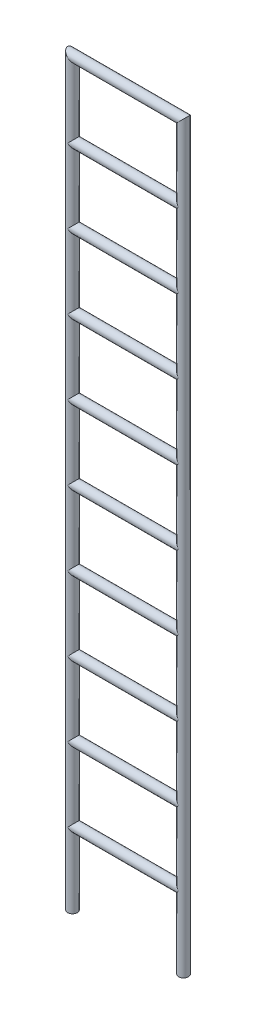
ISO-10303-21;
HEADER;
FILE_DESCRIPTION(('STEP AP214'),'2;1');
FILE_NAME('part.step','',(''),(''),'','','');
FILE_SCHEMA(('AUTOMOTIVE_DESIGN { 1 0 10303 214 1 1 1 1 }'));
ENDSEC;
DATA;
#1=APPLICATION_CONTEXT('core data for automotive mechanical design processes');
#2=APPLICATION_PROTOCOL_DEFINITION('international standard','automotive_design',2000,#1);
#3=PRODUCT_CONTEXT('',#1,'mechanical');
#4=PRODUCT('Part','Part','',(#3));
#5=PRODUCT_RELATED_PRODUCT_CATEGORY('part','',(#4));
#6=PRODUCT_DEFINITION_FORMATION('','',#4);
#7=PRODUCT_DEFINITION_CONTEXT('part definition',#1,'design');
#8=PRODUCT_DEFINITION('design','',#6,#7);
#9=PRODUCT_DEFINITION_SHAPE('','',#8);
#10=(LENGTH_UNIT() NAMED_UNIT(*) SI_UNIT(.MILLI.,.METRE.));
#11=(NAMED_UNIT(*) PLANE_ANGLE_UNIT() SI_UNIT($,.RADIAN.));
#12=(NAMED_UNIT(*) SI_UNIT($,.STERADIAN.) SOLID_ANGLE_UNIT());
#13=UNCERTAINTY_MEASURE_WITH_UNIT(LENGTH_MEASURE(1.E-05),#10,'distance_accuracy_value','');
#14=(GEOMETRIC_REPRESENTATION_CONTEXT(3) GLOBAL_UNCERTAINTY_ASSIGNED_CONTEXT((#13)) GLOBAL_UNIT_ASSIGNED_CONTEXT((#10,
#11,#12)) REPRESENTATION_CONTEXT('',''));
#15=CARTESIAN_POINT('',(0.,0.,0.));
#16=DIRECTION('',(0.,0.,1.));
#17=DIRECTION('',(1.,0.,0.));
#18=AXIS2_PLACEMENT_3D('',#15,#16,#17);
#19=CARTESIAN_POINT('',(-22.1,2743.2,0.));
#20=DIRECTION('',(1.,0.,0.));
#21=DIRECTION('',(0.,0.,-1.));
#22=AXIS2_PLACEMENT_3D('',#19,#20,#21);
#23=CYLINDRICAL_SURFACE('',#22,20.);
#24=CARTESIAN_POINT('',(-7.21644966006352E-13,2743.2,0.));
#25=DIRECTION('',(0.707106781186547,-0.707106781186547,0.));
#26=DIRECTION('',(0.707106781186547,0.707106781186547,0.));
#27=AXIS2_PLACEMENT_3D('',#24,#25,#26);
#28=ELLIPSE('',#27,28.2842712474619,20.);
#29=CARTESIAN_POINT('',(-2.91842067894383E-13,2743.2,20.));
#30=VERTEX_POINT('',#29);
#31=CARTESIAN_POINT('',(-7.21644966006352E-13,2743.2,-20.));
#32=VERTEX_POINT('',#31);
#33=EDGE_CURVE('E108',#30,#32,#28,.F.);
#34=ORIENTED_EDGE('',*,*,#33,.F.);
#35=CARTESIAN_POINT('',(-3.33066907387547E-13,2743.2,0.));
#36=DIRECTION('',(0.707106781186548,0.707106781186548,0.));
#37=DIRECTION('',(-0.707106781186548,0.707106781186548,0.));
#38=AXIS2_PLACEMENT_3D('',#35,#36,#37);
#39=ELLIPSE('',#38,28.2842712474619,20.);
#40=EDGE_CURVE('E219',#30,#32,#39,.T.);
#41=ORIENTED_EDGE('',*,*,#40,.T.);
#42=EDGE_LOOP('',(#34,#41));
#43=FACE_BOUND('',#42,.T.);
#44=CARTESIAN_POINT('',(457.2,2743.2,0.));
#45=DIRECTION('',(0.707106781186548,0.707106781186547,0.));
#46=DIRECTION('',(0.707106781186547,-0.707106781186548,0.));
#47=AXIS2_PLACEMENT_3D('',#44,#45,#46);
#48=ELLIPSE('',#47,28.2842712474619,20.);
#49=CARTESIAN_POINT('',(457.2,2743.2,-20.));
#50=VERTEX_POINT('',#49);
#51=CARTESIAN_POINT('',(457.2,2743.2,20.));
#52=VERTEX_POINT('',#51);
#53=EDGE_CURVE('E12',#50,#52,#48,.T.);
#54=ORIENTED_EDGE('',*,*,#53,.F.);
#55=CARTESIAN_POINT('',(457.2,2743.2,0.));
#56=DIRECTION('',(0.707106781186547,-0.707106781186548,0.));
#57=DIRECTION('',(0.707106781186548,0.707106781186547,0.));
#58=AXIS2_PLACEMENT_3D('',#55,#56,#57);
#59=ELLIPSE('',#58,28.2842712474619,20.);
#60=EDGE_CURVE('E223',#52,#50,#59,.T.);
#61=ORIENTED_EDGE('',*,*,#60,.F.);
#62=EDGE_LOOP('',(#54,#61));
#63=FACE_BOUND('',#62,.T.);
#64=ADVANCED_FACE('F99',(#43,#63),#23,.T.);
#65=CARTESIAN_POINT('',(-22.1,2438.4,0.));
#66=DIRECTION('',(1.,0.,0.));
#67=DIRECTION('',(0.,0.,-1.));
#68=AXIS2_PLACEMENT_3D('',#65,#66,#67);
#69=CYLINDRICAL_SURFACE('',#68,20.);
#70=CARTESIAN_POINT('',(-3.33066907387547E-13,2438.4,0.));
#71=DIRECTION('',(0.707106781186547,-0.707106781186547,0.));
#72=DIRECTION('',(0.707106781186547,0.707106781186547,0.));
#73=AXIS2_PLACEMENT_3D('',#70,#71,#72);
#74=ELLIPSE('',#73,28.2842712474619,20.);
#75=CARTESIAN_POINT('',(-1.11022302462516E-13,2438.4,20.));
#76=VERTEX_POINT('',#75);
#77=CARTESIAN_POINT('',(-3.33066907387547E-13,2438.4,-20.));
#78=VERTEX_POINT('',#77);
#79=EDGE_CURVE('E231',#76,#78,#74,.F.);
#80=ORIENTED_EDGE('',*,*,#79,.F.);
#81=CARTESIAN_POINT('',(1.11022302462516E-13,2438.4,0.));
#82=DIRECTION('',(0.707106781186548,0.707106781186548,0.));
#83=DIRECTION('',(-0.707106781186548,0.707106781186548,0.));
#84=AXIS2_PLACEMENT_3D('',#81,#82,#83);
#85=ELLIPSE('',#84,28.2842712474619,20.);
#86=EDGE_CURVE('E348',#76,#78,#85,.T.);
#87=ORIENTED_EDGE('',*,*,#86,.T.);
#88=EDGE_LOOP('',(#80,#87));
#89=FACE_BOUND('',#88,.T.);
#90=CARTESIAN_POINT('',(457.2,2438.4,0.));
#91=DIRECTION('',(0.707106781186548,0.707106781186547,0.));
#92=DIRECTION('',(0.707106781186547,-0.707106781186548,0.));
#93=AXIS2_PLACEMENT_3D('',#90,#91,#92);
#94=ELLIPSE('',#93,28.2842712474619,20.);
#95=CARTESIAN_POINT('',(457.2,2438.4,-20.));
#96=VERTEX_POINT('',#95);
#97=CARTESIAN_POINT('',(457.2,2438.4,20.));
#98=VERTEX_POINT('',#97);
#99=EDGE_CURVE('E228',#96,#98,#94,.T.);
#100=ORIENTED_EDGE('',*,*,#99,.F.);
#101=CARTESIAN_POINT('',(457.2,2438.4,0.));
#102=DIRECTION('',(0.707106781186547,-0.707106781186548,0.));
#103=DIRECTION('',(0.707106781186548,0.707106781186547,0.));
#104=AXIS2_PLACEMENT_3D('',#101,#102,#103);
#105=ELLIPSE('',#104,28.2842712474619,20.);
#106=EDGE_CURVE('E222',#98,#96,#105,.T.);
#107=ORIENTED_EDGE('',*,*,#106,.F.);
#108=EDGE_LOOP('',(#100,#107));
#109=FACE_BOUND('',#108,.T.);
#110=ADVANCED_FACE('F390',(#89,#109),#69,.T.);
#111=CARTESIAN_POINT('',(-22.1,2133.6,0.));
#112=DIRECTION('',(1.,0.,0.));
#113=DIRECTION('',(0.,0.,-1.));
#114=AXIS2_PLACEMENT_3D('',#111,#112,#113);
#115=CYLINDRICAL_SURFACE('',#114,20.);
#116=CARTESIAN_POINT('',(1.11022302462516E-13,2133.6,0.));
#117=DIRECTION('',(0.707106781186547,-0.707106781186547,0.));
#118=DIRECTION('',(0.707106781186547,0.707106781186547,0.));
#119=AXIS2_PLACEMENT_3D('',#116,#117,#118);
#120=ELLIPSE('',#119,28.2842712474619,20.);
#121=CARTESIAN_POINT('',(0.,2133.6,20.));
#122=VERTEX_POINT('',#121);
#123=CARTESIAN_POINT('',(-4.25040794199271E-13,2133.6,-20.));
#124=VERTEX_POINT('',#123);
#125=EDGE_CURVE('E241',#122,#124,#120,.F.);
#126=ORIENTED_EDGE('',*,*,#125,.F.);
#127=CARTESIAN_POINT('',(0.,2133.6,0.));
#128=DIRECTION('',(0.707106781186547,0.707106781186547,0.));
#129=DIRECTION('',(-0.707106781186548,0.707106781186548,0.));
#130=AXIS2_PLACEMENT_3D('',#127,#128,#129);
#131=ELLIPSE('',#130,28.2842712474619,20.);
#132=EDGE_CURVE('E341',#122,#124,#131,.T.);
#133=ORIENTED_EDGE('',*,*,#132,.T.);
#134=EDGE_LOOP('',(#126,#133));
#135=FACE_BOUND('',#134,.T.);
#136=CARTESIAN_POINT('',(457.2,2133.6,0.));
#137=DIRECTION('',(0.707106781186548,0.707106781186547,0.));
#138=DIRECTION('',(0.707106781186547,-0.707106781186548,0.));
#139=AXIS2_PLACEMENT_3D('',#136,#137,#138);
#140=ELLIPSE('',#139,28.2842712474619,20.);
#141=CARTESIAN_POINT('',(457.2,2133.6,-20.));
#142=VERTEX_POINT('',#141);
#143=CARTESIAN_POINT('',(457.200000000001,2133.6,20.));
#144=VERTEX_POINT('',#143);
#145=EDGE_CURVE('E237',#142,#144,#140,.T.);
#146=ORIENTED_EDGE('',*,*,#145,.F.);
#147=CARTESIAN_POINT('',(457.2,2133.6,0.));
#148=DIRECTION('',(0.707106781186547,-0.707106781186548,0.));
#149=DIRECTION('',(0.707106781186548,0.707106781186547,0.));
#150=AXIS2_PLACEMENT_3D('',#147,#148,#149);
#151=ELLIPSE('',#150,28.2842712474619,20.);
#152=EDGE_CURVE('E344',#144,#142,#151,.T.);
#153=ORIENTED_EDGE('',*,*,#152,.F.);
#154=EDGE_LOOP('',(#146,#153));
#155=FACE_BOUND('',#154,.T.);
#156=ADVANCED_FACE('F395',(#135,#155),#115,.T.);
#157=CARTESIAN_POINT('',(-22.1000000000002,1828.8,0.));
#158=DIRECTION('',(1.,0.,0.));
#159=DIRECTION('',(0.,0.,-1.));
#160=AXIS2_PLACEMENT_3D('',#157,#158,#159);
#161=CYLINDRICAL_SURFACE('',#160,20.);
#162=CARTESIAN_POINT('',(0.,1828.8,0.));
#163=DIRECTION('',(0.707106781186547,-0.707106781186547,0.));
#164=DIRECTION('',(0.707106781186547,0.707106781186547,0.));
#165=AXIS2_PLACEMENT_3D('',#162,#163,#164);
#166=ELLIPSE('',#165,28.2842712474619,20.);
#167=CARTESIAN_POINT('',(-1.66533453693774E-13,1828.8,20.));
#168=VERTEX_POINT('',#167);
#169=CARTESIAN_POINT('',(0.,1828.8,-20.));
#170=VERTEX_POINT('',#169);
#171=EDGE_CURVE('E249',#168,#170,#166,.F.);
#172=ORIENTED_EDGE('',*,*,#171,.F.);
#173=CARTESIAN_POINT('',(-3.88578058618805E-13,1828.8,0.));
#174=DIRECTION('',(0.707106781186547,0.707106781186547,0.));
#175=DIRECTION('',(-0.707106781186548,0.707106781186548,0.));
#176=AXIS2_PLACEMENT_3D('',#173,#174,#175);
#177=ELLIPSE('',#176,28.2842712474619,20.);
#178=EDGE_CURVE('E334',#168,#170,#177,.T.);
#179=ORIENTED_EDGE('',*,*,#178,.T.);
#180=EDGE_LOOP('',(#172,#179));
#181=FACE_BOUND('',#180,.T.);
#182=CARTESIAN_POINT('',(457.2,1828.8,0.));
#183=DIRECTION('',(0.707106781186548,0.707106781186547,0.));
#184=DIRECTION('',(0.707106781186547,-0.707106781186548,0.));
#185=AXIS2_PLACEMENT_3D('',#182,#183,#184);
#186=ELLIPSE('',#185,28.2842712474619,20.);
#187=CARTESIAN_POINT('',(457.2,1828.8,-20.));
#188=VERTEX_POINT('',#187);
#189=CARTESIAN_POINT('',(457.2,1828.8,20.));
#190=VERTEX_POINT('',#189);
#191=EDGE_CURVE('E245',#188,#190,#186,.T.);
#192=ORIENTED_EDGE('',*,*,#191,.F.);
#193=CARTESIAN_POINT('',(457.2,1828.8,0.));
#194=DIRECTION('',(0.707106781186547,-0.707106781186548,0.));
#195=DIRECTION('',(0.707106781186548,0.707106781186547,0.));
#196=AXIS2_PLACEMENT_3D('',#193,#194,#195);
#197=ELLIPSE('',#196,28.2842712474619,20.);
#198=EDGE_CURVE('E337',#190,#188,#197,.T.);
#199=ORIENTED_EDGE('',*,*,#198,.F.);
#200=EDGE_LOOP('',(#192,#199));
#201=FACE_BOUND('',#200,.T.);
#202=ADVANCED_FACE('F401',(#181,#201),#161,.T.);
#203=CARTESIAN_POINT('',(-22.1,1524.,0.));
#204=DIRECTION('',(1.,0.,0.));
#205=DIRECTION('',(0.,0.,-1.));
#206=AXIS2_PLACEMENT_3D('',#203,#204,#205);
#207=CYLINDRICAL_SURFACE('',#206,20.);
#208=CARTESIAN_POINT('',(-3.88578058618805E-13,1524.,0.));
#209=DIRECTION('',(0.707106781186547,-0.707106781186547,0.));
#210=DIRECTION('',(0.707106781186547,0.707106781186547,0.));
#211=AXIS2_PLACEMENT_3D('',#208,#209,#210);
#212=ELLIPSE('',#211,28.2842712474619,20.);
#213=CARTESIAN_POINT('',(-1.48302085903541E-13,1524.,20.));
#214=VERTEX_POINT('',#213);
#215=CARTESIAN_POINT('',(-7.67631909412214E-13,1524.,-20.));
#216=VERTEX_POINT('',#215);
#217=EDGE_CURVE('E257',#214,#216,#212,.F.);
#218=ORIENTED_EDGE('',*,*,#217,.F.);
#219=CARTESIAN_POINT('',(-2.22044604925031E-13,1524.,0.));
#220=DIRECTION('',(0.707106781186547,0.707106781186547,0.));
#221=DIRECTION('',(-0.707106781186548,0.707106781186548,0.));
#222=AXIS2_PLACEMENT_3D('',#219,#220,#221);
#223=ELLIPSE('',#222,28.2842712474619,20.);
#224=EDGE_CURVE('E327',#214,#216,#223,.T.);
#225=ORIENTED_EDGE('',*,*,#224,.T.);
#226=EDGE_LOOP('',(#218,#225));
#227=FACE_BOUND('',#226,.T.);
#228=CARTESIAN_POINT('',(457.2,1524.,0.));
#229=DIRECTION('',(0.707106781186548,0.707106781186547,0.));
#230=DIRECTION('',(0.707106781186547,-0.707106781186548,0.));
#231=AXIS2_PLACEMENT_3D('',#228,#229,#230);
#232=ELLIPSE('',#231,28.2842712474619,20.);
#233=CARTESIAN_POINT('',(457.2,1524.,-20.));
#234=VERTEX_POINT('',#233);
#235=CARTESIAN_POINT('',(457.2,1524.,20.));
#236=VERTEX_POINT('',#235);
#237=EDGE_CURVE('E253',#234,#236,#232,.T.);
#238=ORIENTED_EDGE('',*,*,#237,.F.);
#239=CARTESIAN_POINT('',(457.2,1524.,0.));
#240=DIRECTION('',(0.707106781186547,-0.707106781186548,0.));
#241=DIRECTION('',(0.707106781186548,0.707106781186547,0.));
#242=AXIS2_PLACEMENT_3D('',#239,#240,#241);
#243=ELLIPSE('',#242,28.2842712474619,20.);
#244=EDGE_CURVE('E330',#236,#234,#243,.T.);
#245=ORIENTED_EDGE('',*,*,#244,.F.);
#246=EDGE_LOOP('',(#238,#245));
#247=FACE_BOUND('',#246,.T.);
#248=ADVANCED_FACE('F405',(#227,#247),#207,.T.);
#249=CARTESIAN_POINT('',(-22.1,1219.2,0.));
#250=DIRECTION('',(1.,0.,0.));
#251=DIRECTION('',(0.,0.,-1.));
#252=AXIS2_PLACEMENT_3D('',#249,#250,#251);
#253=CYLINDRICAL_SURFACE('',#252,20.);
#254=CARTESIAN_POINT('',(-2.22044604925031E-13,1219.2,0.));
#255=DIRECTION('',(0.707106781186547,-0.707106781186547,0.));
#256=DIRECTION('',(0.707106781186547,0.707106781186547,0.));
#257=AXIS2_PLACEMENT_3D('',#254,#255,#256);
#258=ELLIPSE('',#257,28.2842712474619,20.);
#259=CARTESIAN_POINT('',(0.,1219.2,20.));
#260=VERTEX_POINT('',#259);
#261=CARTESIAN_POINT('',(-6.79603078652629E-13,1219.2,-20.));
#262=VERTEX_POINT('',#261);
#263=EDGE_CURVE('E265',#260,#262,#258,.F.);
#264=ORIENTED_EDGE('',*,*,#263,.F.);
#265=CARTESIAN_POINT('',(-1.11022302462516E-13,1219.2,0.));
#266=DIRECTION('',(0.707106781186548,0.707106781186548,0.));
#267=DIRECTION('',(-0.707106781186548,0.707106781186548,0.));
#268=AXIS2_PLACEMENT_3D('',#265,#266,#267);
#269=ELLIPSE('',#268,28.2842712474619,20.);
#270=EDGE_CURVE('E320',#260,#262,#269,.T.);
#271=ORIENTED_EDGE('',*,*,#270,.T.);
#272=EDGE_LOOP('',(#264,#271));
#273=FACE_BOUND('',#272,.T.);
#274=CARTESIAN_POINT('',(457.2,1219.2,0.));
#275=DIRECTION('',(0.707106781186548,0.707106781186547,0.));
#276=DIRECTION('',(0.707106781186547,-0.707106781186548,0.));
#277=AXIS2_PLACEMENT_3D('',#274,#275,#276);
#278=ELLIPSE('',#277,28.2842712474619,20.);
#279=CARTESIAN_POINT('',(457.2,1219.2,-20.));
#280=VERTEX_POINT('',#279);
#281=CARTESIAN_POINT('',(457.2,1219.2,20.));
#282=VERTEX_POINT('',#281);
#283=EDGE_CURVE('E261',#280,#282,#278,.T.);
#284=ORIENTED_EDGE('',*,*,#283,.F.);
#285=CARTESIAN_POINT('',(457.2,1219.2,0.));
#286=DIRECTION('',(0.707106781186547,-0.707106781186548,0.));
#287=DIRECTION('',(0.707106781186548,0.707106781186547,0.));
#288=AXIS2_PLACEMENT_3D('',#285,#286,#287);
#289=ELLIPSE('',#288,28.2842712474619,20.);
#290=EDGE_CURVE('E323',#282,#280,#289,.T.);
#291=ORIENTED_EDGE('',*,*,#290,.F.);
#292=EDGE_LOOP('',(#284,#291));
#293=FACE_BOUND('',#292,.T.);
#294=ADVANCED_FACE('F409',(#273,#293),#253,.T.);
#295=CARTESIAN_POINT('',(-22.1,914.4,0.));
#296=DIRECTION('',(1.,0.,0.));
#297=DIRECTION('',(0.,0.,-1.));
#298=AXIS2_PLACEMENT_3D('',#295,#296,#297);
#299=CYLINDRICAL_SURFACE('',#298,20.);
#300=CARTESIAN_POINT('',(-1.11022302462516E-13,914.4,0.));
#301=DIRECTION('',(0.707106781186547,-0.707106781186547,0.));
#302=DIRECTION('',(0.707106781186547,0.707106781186547,0.));
#303=AXIS2_PLACEMENT_3D('',#300,#301,#302);
#304=ELLIPSE('',#303,28.2842712474619,20.);
#305=CARTESIAN_POINT('',(0.,914.4,20.));
#306=VERTEX_POINT('',#305);
#307=CARTESIAN_POINT('',(-5.68580776190114E-13,914.4,-20.));
#308=VERTEX_POINT('',#307);
#309=EDGE_CURVE('E273',#306,#308,#304,.F.);
#310=ORIENTED_EDGE('',*,*,#309,.F.);
#311=CARTESIAN_POINT('',(-1.66533453693773E-13,914.4,0.));
#312=DIRECTION('',(0.707106781186548,0.707106781186548,0.));
#313=DIRECTION('',(-0.707106781186548,0.707106781186548,0.));
#314=AXIS2_PLACEMENT_3D('',#311,#312,#313);
#315=ELLIPSE('',#314,28.2842712474619,20.);
#316=EDGE_CURVE('E313',#306,#308,#315,.T.);
#317=ORIENTED_EDGE('',*,*,#316,.T.);
#318=EDGE_LOOP('',(#310,#317));
#319=FACE_BOUND('',#318,.T.);
#320=CARTESIAN_POINT('',(457.2,914.4,0.));
#321=DIRECTION('',(0.707106781186548,0.707106781186547,0.));
#322=DIRECTION('',(0.707106781186547,-0.707106781186548,0.));
#323=AXIS2_PLACEMENT_3D('',#320,#321,#322);
#324=ELLIPSE('',#323,28.2842712474619,20.);
#325=CARTESIAN_POINT('',(457.2,914.4,-20.));
#326=VERTEX_POINT('',#325);
#327=CARTESIAN_POINT('',(457.2,914.4,20.));
#328=VERTEX_POINT('',#327);
#329=EDGE_CURVE('E269',#326,#328,#324,.T.);
#330=ORIENTED_EDGE('',*,*,#329,.F.);
#331=CARTESIAN_POINT('',(457.2,914.4,0.));
#332=DIRECTION('',(0.707106781186547,-0.707106781186548,0.));
#333=DIRECTION('',(0.707106781186548,0.707106781186547,0.));
#334=AXIS2_PLACEMENT_3D('',#331,#332,#333);
#335=ELLIPSE('',#334,28.2842712474619,20.);
#336=EDGE_CURVE('E316',#328,#326,#335,.T.);
#337=ORIENTED_EDGE('',*,*,#336,.F.);
#338=EDGE_LOOP('',(#330,#337));
#339=FACE_BOUND('',#338,.T.);
#340=ADVANCED_FACE('F413',(#319,#339),#299,.T.);
#341=CARTESIAN_POINT('',(-22.1,609.6,0.));
#342=DIRECTION('',(1.,0.,0.));
#343=DIRECTION('',(0.,0.,-1.));
#344=AXIS2_PLACEMENT_3D('',#341,#342,#343);
#345=CYLINDRICAL_SURFACE('',#344,20.);
#346=CARTESIAN_POINT('',(-1.64798730217797E-13,609.6,0.));
#347=DIRECTION('',(0.707106781186548,-0.707106781186547,0.));
#348=DIRECTION('',(0.707106781186548,0.707106781186547,0.));
#349=AXIS2_PLACEMENT_3D('',#346,#347,#348);
#350=ELLIPSE('',#349,28.2842712474619,20.);
#351=CARTESIAN_POINT('',(-1.10154940724527E-13,609.6,20.));
#352=VERTEX_POINT('',#351);
#353=CARTESIAN_POINT('',(-2.99681866121232E-13,609.6,-20.));
#354=VERTEX_POINT('',#353);
#355=EDGE_CURVE('E281',#352,#354,#350,.F.);
#356=ORIENTED_EDGE('',*,*,#355,.F.);
#357=CARTESIAN_POINT('',(0.,609.6,0.));
#358=DIRECTION('',(0.707106781186547,0.707106781186547,0.));
#359=DIRECTION('',(-0.707106781186548,0.707106781186548,0.));
#360=AXIS2_PLACEMENT_3D('',#357,#358,#359);
#361=ELLIPSE('',#360,28.2842712474619,20.);
#362=EDGE_CURVE('E299',#352,#354,#361,.T.);
#363=ORIENTED_EDGE('',*,*,#362,.T.);
#364=EDGE_LOOP('',(#356,#363));
#365=FACE_BOUND('',#364,.T.);
#366=CARTESIAN_POINT('',(457.2,609.6,0.));
#367=DIRECTION('',(0.707106781186548,0.707106781186547,0.));
#368=DIRECTION('',(0.707106781186547,-0.707106781186548,0.));
#369=AXIS2_PLACEMENT_3D('',#366,#367,#368);
#370=ELLIPSE('',#369,28.2842712474619,20.);
#371=CARTESIAN_POINT('',(457.2,609.6,-20.));
#372=VERTEX_POINT('',#371);
#373=CARTESIAN_POINT('',(457.2,609.6,20.));
#374=VERTEX_POINT('',#373);
#375=EDGE_CURVE('E277',#372,#374,#370,.T.);
#376=ORIENTED_EDGE('',*,*,#375,.F.);
#377=CARTESIAN_POINT('',(457.2,609.6,0.));
#378=DIRECTION('',(0.707106781186547,-0.707106781186548,0.));
#379=DIRECTION('',(0.707106781186548,0.707106781186547,0.));
#380=AXIS2_PLACEMENT_3D('',#377,#378,#379);
#381=ELLIPSE('',#380,28.2842712474619,20.);
#382=EDGE_CURVE('E309',#374,#372,#381,.T.);
#383=ORIENTED_EDGE('',*,*,#382,.F.);
#384=EDGE_LOOP('',(#376,#383));
#385=FACE_BOUND('',#384,.T.);
#386=ADVANCED_FACE('F387',(#365,#385),#345,.T.);
#387=CARTESIAN_POINT('',(-22.1,304.8,0.));
#388=DIRECTION('',(1.,0.,0.));
#389=DIRECTION('',(0.,0.,-1.));
#390=AXIS2_PLACEMENT_3D('',#387,#388,#389);
#391=CYLINDRICAL_SURFACE('',#390,20.);
#392=CARTESIAN_POINT('',(0.,304.8,0.));
#393=DIRECTION('',(0.707106781186547,-0.707106781186547,0.));
#394=DIRECTION('',(0.707106781186547,0.707106781186547,0.));
#395=AXIS2_PLACEMENT_3D('',#392,#393,#394);
#396=ELLIPSE('',#395,28.2842712474619,20.);
#397=CARTESIAN_POINT('',(1.17756934401283E-13,304.8,20.));
#398=VERTEX_POINT('',#397);
#399=CARTESIAN_POINT('',(1.17756934401283E-13,304.8,-20.));
#400=VERTEX_POINT('',#399);
#401=EDGE_CURVE('E289',#398,#400,#396,.F.);
#402=ORIENTED_EDGE('',*,*,#401,.F.);
#403=CARTESIAN_POINT('',(-1.11022302462516E-13,304.8,0.));
#404=DIRECTION('',(0.707106781186548,0.707106781186548,0.));
#405=DIRECTION('',(-0.707106781186548,0.707106781186548,0.));
#406=AXIS2_PLACEMENT_3D('',#403,#404,#405);
#407=ELLIPSE('',#406,28.2842712474619,20.);
#408=EDGE_CURVE('E293',#398,#400,#407,.T.);
#409=ORIENTED_EDGE('',*,*,#408,.T.);
#410=EDGE_LOOP('',(#402,#409));
#411=FACE_BOUND('',#410,.T.);
#412=CARTESIAN_POINT('',(457.2,304.8,0.));
#413=DIRECTION('',(0.707106781186548,0.707106781186547,0.));
#414=DIRECTION('',(0.707106781186547,-0.707106781186548,0.));
#415=AXIS2_PLACEMENT_3D('',#412,#413,#414);
#416=ELLIPSE('',#415,28.2842712474619,20.);
#417=CARTESIAN_POINT('',(457.2,304.8,-20.));
#418=VERTEX_POINT('',#417);
#419=CARTESIAN_POINT('',(457.2,304.8,20.));
#420=VERTEX_POINT('',#419);
#421=EDGE_CURVE('E285',#418,#420,#416,.T.);
#422=ORIENTED_EDGE('',*,*,#421,.F.);
#423=CARTESIAN_POINT('',(457.2,304.8,0.));
#424=DIRECTION('',(0.707106781186547,-0.707106781186548,0.));
#425=DIRECTION('',(0.707106781186548,0.707106781186547,0.));
#426=AXIS2_PLACEMENT_3D('',#423,#424,#425);
#427=ELLIPSE('',#426,28.2842712474619,20.);
#428=EDGE_CURVE('E298',#420,#418,#427,.T.);
#429=ORIENTED_EDGE('',*,*,#428,.F.);
#430=EDGE_LOOP('',(#422,#429));
#431=FACE_BOUND('',#430,.T.);
#432=ADVANCED_FACE('F373',(#411,#431),#391,.T.);
#433=CARTESIAN_POINT('',(457.2,0.,0.));
#434=DIRECTION('',(0.,1.,0.));
#435=DIRECTION('',(-1.,0.,0.));
#436=AXIS2_PLACEMENT_3D('',#433,#434,#435);
#437=PLANE('',#436);
#438=CARTESIAN_POINT('',(457.2,0.,0.));
#439=DIRECTION('',(0.,1.,0.));
#440=DIRECTION('',(-1.,0.,0.));
#441=AXIS2_PLACEMENT_3D('',#438,#439,#440);
#442=CIRCLE('',#441,20.);
#443=CARTESIAN_POINT('',(437.2,0.,0.));
#444=VERTEX_POINT('',#443);
#445=EDGE_CURVE('E294',#444,#444,#442,.T.);
#446=ORIENTED_EDGE('',*,*,#445,.F.);
#447=EDGE_LOOP('',(#446));
#448=FACE_BOUND('',#447,.T.);
#449=ADVANCED_FACE('F101',(#448),#437,.F.);
#450=CARTESIAN_POINT('',(-1.11022302462516E-13,0.,0.));
#451=DIRECTION('',(0.,-1.,0.));
#452=DIRECTION('',(1.,0.,0.));
#453=AXIS2_PLACEMENT_3D('',#450,#451,#452);
#454=PLANE('',#453);
#455=CARTESIAN_POINT('',(-1.11022302462516E-13,0.,0.));
#456=DIRECTION('',(0.,-1.,0.));
#457=DIRECTION('',(1.,0.,0.));
#458=AXIS2_PLACEMENT_3D('',#455,#456,#457);
#459=CIRCLE('',#458,20.);
#460=CARTESIAN_POINT('',(19.9999999999999,0.,0.));
#461=VERTEX_POINT('',#460);
#462=EDGE_CURVE('E303',#461,#461,#459,.T.);
#463=ORIENTED_EDGE('',*,*,#462,.T.);
#464=EDGE_LOOP('',(#463));
#465=FACE_BOUND('',#464,.T.);
#466=ADVANCED_FACE('F379',(#465),#454,.T.);
#467=CARTESIAN_POINT('',(457.2,326.9,0.));
#468=DIRECTION('',(0.,-1.,0.));
#469=DIRECTION('',(1.,0.,0.));
#470=AXIS2_PLACEMENT_3D('',#467,#468,#469);
#471=CYLINDRICAL_SURFACE('',#470,20.);
#472=ORIENTED_EDGE('',*,*,#53,.T.);
#473=ORIENTED_EDGE('',*,*,#60,.T.);
#474=EDGE_LOOP('',(#472,#473));
#475=FACE_BOUND('',#474,.T.);
#476=CARTESIAN_POINT('',(457.200000000001,3048.,0.));
#477=DIRECTION('',(0.707106781186547,-0.707106781186548,0.));
#478=DIRECTION('',(0.707106781186548,0.707106781186547,0.));
#479=AXIS2_PLACEMENT_3D('',#476,#477,#478);
#480=ELLIPSE('',#479,28.2842712474619,20.);
#481=CARTESIAN_POINT('',(477.200000000001,3068.,0.));
#482=VERTEX_POINT('',#481);
#483=EDGE_CURVE('E359',#482,#482,#480,.T.);
#484=ORIENTED_EDGE('',*,*,#483,.T.);
#485=EDGE_LOOP('',(#484));
#486=FACE_BOUND('',#485,.T.);
#487=ORIENTED_EDGE('',*,*,#145,.T.);
#488=ORIENTED_EDGE('',*,*,#152,.T.);
#489=EDGE_LOOP('',(#487,#488));
#490=FACE_BOUND('',#489,.T.);
#491=ORIENTED_EDGE('',*,*,#237,.T.);
#492=ORIENTED_EDGE('',*,*,#244,.T.);
#493=EDGE_LOOP('',(#491,#492));
#494=FACE_BOUND('',#493,.T.);
#495=ORIENTED_EDGE('',*,*,#329,.T.);
#496=ORIENTED_EDGE('',*,*,#336,.T.);
#497=EDGE_LOOP('',(#495,#496));
#498=FACE_BOUND('',#497,.T.);
#499=ORIENTED_EDGE('',*,*,#421,.T.);
#500=ORIENTED_EDGE('',*,*,#428,.T.);
#501=EDGE_LOOP('',(#499,#500));
#502=FACE_BOUND('',#501,.T.);
#503=ORIENTED_EDGE('',*,*,#445,.T.);
#504=EDGE_LOOP('',(#503));
#505=FACE_BOUND('',#504,.T.);
#506=ORIENTED_EDGE('',*,*,#375,.T.);
#507=ORIENTED_EDGE('',*,*,#382,.T.);
#508=EDGE_LOOP('',(#506,#507));
#509=FACE_BOUND('',#508,.T.);
#510=ORIENTED_EDGE('',*,*,#283,.T.);
#511=ORIENTED_EDGE('',*,*,#290,.T.);
#512=EDGE_LOOP('',(#510,#511));
#513=FACE_BOUND('',#512,.T.);
#514=ORIENTED_EDGE('',*,*,#191,.T.);
#515=ORIENTED_EDGE('',*,*,#198,.T.);
#516=EDGE_LOOP('',(#514,#515));
#517=FACE_BOUND('',#516,.T.);
#518=ORIENTED_EDGE('',*,*,#99,.T.);
#519=ORIENTED_EDGE('',*,*,#106,.T.);
#520=EDGE_LOOP('',(#518,#519));
#521=FACE_BOUND('',#520,.T.);
#522=ADVANCED_FACE('F370',(#475,#486,#490,#494,#498,#502,#505,#509,#513,#517,#521),#471,.T.);
#523=CARTESIAN_POINT('',(-1.11022302462516E-13,0.,0.));
#524=DIRECTION('',(0.,1.,0.));
#525=DIRECTION('',(0.,0.,1.));
#526=AXIS2_PLACEMENT_3D('',#523,#524,#525);
#527=CYLINDRICAL_SURFACE('',#526,20.);
#528=ORIENTED_EDGE('',*,*,#462,.F.);
#529=EDGE_LOOP('',(#528));
#530=FACE_BOUND('',#529,.T.);
#531=ORIENTED_EDGE('',*,*,#408,.F.);
#532=ORIENTED_EDGE('',*,*,#401,.T.);
#533=EDGE_LOOP('',(#531,#532));
#534=FACE_BOUND('',#533,.T.);
#535=ORIENTED_EDGE('',*,*,#362,.F.);
#536=ORIENTED_EDGE('',*,*,#355,.T.);
#537=EDGE_LOOP('',(#535,#536));
#538=FACE_BOUND('',#537,.T.);
#539=ORIENTED_EDGE('',*,*,#316,.F.);
#540=ORIENTED_EDGE('',*,*,#309,.T.);
#541=EDGE_LOOP('',(#539,#540));
#542=FACE_BOUND('',#541,.T.);
#543=ORIENTED_EDGE('',*,*,#270,.F.);
#544=ORIENTED_EDGE('',*,*,#263,.T.);
#545=EDGE_LOOP('',(#543,#544));
#546=FACE_BOUND('',#545,.T.);
#547=ORIENTED_EDGE('',*,*,#224,.F.);
#548=ORIENTED_EDGE('',*,*,#217,.T.);
#549=EDGE_LOOP('',(#547,#548));
#550=FACE_BOUND('',#549,.T.);
#551=ORIENTED_EDGE('',*,*,#178,.F.);
#552=ORIENTED_EDGE('',*,*,#171,.T.);
#553=EDGE_LOOP('',(#551,#552));
#554=FACE_BOUND('',#553,.T.);
#555=ORIENTED_EDGE('',*,*,#132,.F.);
#556=ORIENTED_EDGE('',*,*,#125,.T.);
#557=EDGE_LOOP('',(#555,#556));
#558=FACE_BOUND('',#557,.T.);
#559=ORIENTED_EDGE('',*,*,#86,.F.);
#560=ORIENTED_EDGE('',*,*,#79,.T.);
#561=EDGE_LOOP('',(#559,#560));
#562=FACE_BOUND('',#561,.T.);
#563=ORIENTED_EDGE('',*,*,#40,.F.);
#564=ORIENTED_EDGE('',*,*,#33,.T.);
#565=EDGE_LOOP('',(#563,#564));
#566=FACE_BOUND('',#565,.T.);
#567=CARTESIAN_POINT('',(-7.21644966006352E-13,3048.,0.));
#568=DIRECTION('',(0.707106781186548,0.707106781186548,0.));
#569=DIRECTION('',(-0.707106781186548,0.707106781186548,0.));
#570=AXIS2_PLACEMENT_3D('',#567,#568,#569);
#571=ELLIPSE('',#570,28.2842712474619,20.);
#572=CARTESIAN_POINT('',(-20.0000000000007,3068.,0.));
#573=VERTEX_POINT('',#572);
#574=EDGE_CURVE('E357',#573,#573,#571,.T.);
#575=ORIENTED_EDGE('',*,*,#574,.F.);
#576=EDGE_LOOP('',(#575));
#577=FACE_BOUND('',#576,.T.);
#578=ADVANCED_FACE('F225',(#530,#534,#538,#542,#546,#550,#554,#558,#562,#566,#577),#527,.T.);
#579=CARTESIAN_POINT('',(-22.1000000000005,3048.,0.));
#580=DIRECTION('',(1.,0.,0.));
#581=DIRECTION('',(0.,0.,-1.));
#582=AXIS2_PLACEMENT_3D('',#579,#580,#581);
#583=CYLINDRICAL_SURFACE('',#582,20.);
#584=ORIENTED_EDGE('',*,*,#574,.T.);
#585=EDGE_LOOP('',(#584));
#586=FACE_BOUND('',#585,.T.);
#587=ORIENTED_EDGE('',*,*,#483,.F.);
#588=EDGE_LOOP('',(#587));
#589=FACE_BOUND('',#588,.T.);
#590=ADVANCED_FACE('F367',(#586,#589),#583,.T.);
#591=CLOSED_SHELL('',(#64,#110,#156,#202,#248,#294,#340,#386,#432,#449,#466,#522,#578,#590));
#592=MANIFOLD_SOLID_BREP('B2',#591);
#593=ADVANCED_BREP_SHAPE_REPRESENTATION('',(#18,#592),#14);
#594=SHAPE_DEFINITION_REPRESENTATION(#9,#593);
ENDSEC;
END-ISO-10303-21;
